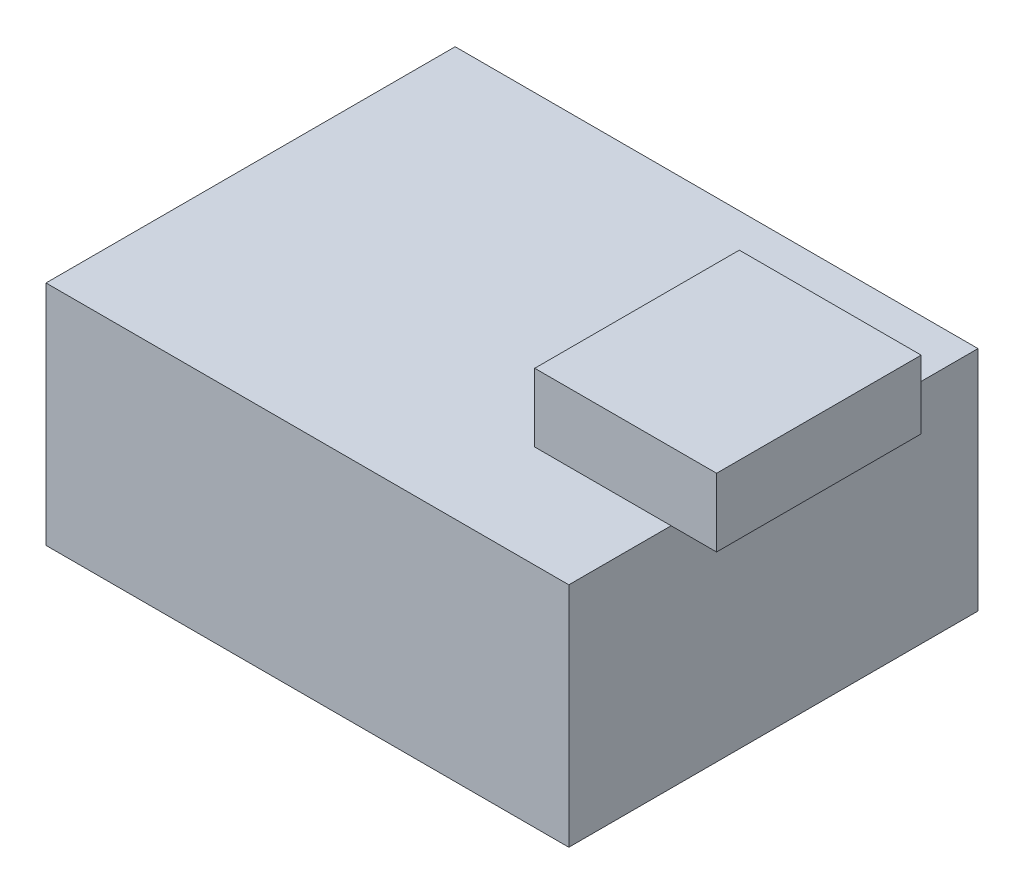
ISO-10303-21;
HEADER;
FILE_DESCRIPTION(('STEP AP214'),'2;1');
FILE_NAME('part.step','',(''),(''),'','','');
FILE_SCHEMA(('AUTOMOTIVE_DESIGN { 1 0 10303 214 1 1 1 1 }'));
ENDSEC;
DATA;
#1=APPLICATION_CONTEXT('core data for automotive mechanical design processes');
#2=APPLICATION_PROTOCOL_DEFINITION('international standard','automotive_design',2000,#1);
#3=PRODUCT_CONTEXT('',#1,'mechanical');
#4=PRODUCT('Part','Part','',(#3));
#5=PRODUCT_RELATED_PRODUCT_CATEGORY('part','',(#4));
#6=PRODUCT_DEFINITION_FORMATION('','',#4);
#7=PRODUCT_DEFINITION_CONTEXT('part definition',#1,'design');
#8=PRODUCT_DEFINITION('design','',#6,#7);
#9=PRODUCT_DEFINITION_SHAPE('','',#8);
#10=(LENGTH_UNIT() NAMED_UNIT(*) SI_UNIT(.MILLI.,.METRE.));
#11=(NAMED_UNIT(*) PLANE_ANGLE_UNIT() SI_UNIT($,.RADIAN.));
#12=(NAMED_UNIT(*) SI_UNIT($,.STERADIAN.) SOLID_ANGLE_UNIT());
#13=UNCERTAINTY_MEASURE_WITH_UNIT(LENGTH_MEASURE(1.E-05),#10,'distance_accuracy_value','');
#14=(GEOMETRIC_REPRESENTATION_CONTEXT(3) GLOBAL_UNCERTAINTY_ASSIGNED_CONTEXT((#13)) GLOBAL_UNIT_ASSIGNED_CONTEXT((#10,
#11,#12)) REPRESENTATION_CONTEXT('',''));
#15=CARTESIAN_POINT('',(0.,0.,0.));
#16=DIRECTION('',(0.,0.,1.));
#17=DIRECTION('',(1.,0.,0.));
#18=AXIS2_PLACEMENT_3D('',#15,#16,#17);
#19=CARTESIAN_POINT('',(0.,10.,0.));
#20=DIRECTION('',(0.,-1.,0.));
#21=DIRECTION('',(0.,0.,-1.));
#22=AXIS2_PLACEMENT_3D('',#19,#20,#21);
#23=PLANE('',#22);
#24=DIRECTION('',(-1.,0.,0.));
#25=VECTOR('',#24,1.);
#26=CARTESIAN_POINT('',(17.,10.,-13.5));
#27=LINE('',#26,#25);
#28=CARTESIAN_POINT('',(23.,10.,-13.5));
#29=VERTEX_POINT('',#28);
#30=CARTESIAN_POINT('',(17.,10.,-13.5));
#31=VERTEX_POINT('',#30);
#32=EDGE_CURVE('E11',#29,#31,#27,.T.);
#33=ORIENTED_EDGE('',*,*,#32,.F.);
#34=DIRECTION('',(0.,0.,-1.));
#35=VECTOR('',#34,1.);
#36=CARTESIAN_POINT('',(23.,10.,0.));
#37=LINE('',#36,#35);
#38=CARTESIAN_POINT('',(23.,10.,-18.));
#39=VERTEX_POINT('',#38);
#40=EDGE_CURVE('E157',#29,#39,#37,.T.);
#41=ORIENTED_EDGE('',*,*,#40,.T.);
#42=DIRECTION('',(-1.,0.,0.));
#43=VECTOR('',#42,1.);
#44=CARTESIAN_POINT('',(0.,10.,-18.));
#45=LINE('',#44,#43);
#46=CARTESIAN_POINT('',(0.,10.,-18.));
#47=VERTEX_POINT('',#46);
#48=EDGE_CURVE('E161',#39,#47,#45,.T.);
#49=ORIENTED_EDGE('',*,*,#48,.T.);
#50=DIRECTION('',(0.,0.,1.));
#51=VECTOR('',#50,1.);
#52=CARTESIAN_POINT('',(0.,10.,0.));
#53=LINE('',#52,#51);
#54=CARTESIAN_POINT('',(0.,10.,0.));
#55=VERTEX_POINT('',#54);
#56=EDGE_CURVE('E149',#47,#55,#53,.T.);
#57=ORIENTED_EDGE('',*,*,#56,.T.);
#58=DIRECTION('',(1.,0.,0.));
#59=VECTOR('',#58,1.);
#60=CARTESIAN_POINT('',(0.,10.,0.));
#61=LINE('',#60,#59);
#62=CARTESIAN_POINT('',(23.,10.,0.));
#63=VERTEX_POINT('',#62);
#64=EDGE_CURVE('E153',#55,#63,#61,.T.);
#65=ORIENTED_EDGE('',*,*,#64,.T.);
#66=CARTESIAN_POINT('',(23.,10.,-4.5));
#67=VERTEX_POINT('',#66);
#68=EDGE_CURVE('E158',#63,#67,#37,.T.);
#69=ORIENTED_EDGE('',*,*,#68,.T.);
#70=DIRECTION('',(1.,0.,0.));
#71=VECTOR('',#70,1.);
#72=CARTESIAN_POINT('',(17.,10.,-4.5));
#73=LINE('',#72,#71);
#74=CARTESIAN_POINT('',(17.,10.,-4.5));
#75=VERTEX_POINT('',#74);
#76=EDGE_CURVE('E65',#75,#67,#73,.T.);
#77=ORIENTED_EDGE('',*,*,#76,.F.);
#78=DIRECTION('',(0.,0.,1.));
#79=VECTOR('',#78,1.);
#80=CARTESIAN_POINT('',(17.,10.,-13.5));
#81=LINE('',#80,#79);
#82=EDGE_CURVE('E61',#31,#75,#81,.T.);
#83=ORIENTED_EDGE('',*,*,#82,.F.);
#84=EDGE_LOOP('',(#33,#41,#49,#57,#65,#69,#77,#83));
#85=FACE_BOUND('',#84,.T.);
#86=ADVANCED_FACE('F43',(#85),#23,.F.);
#87=CARTESIAN_POINT('',(0.,10.,0.));
#88=DIRECTION('',(1.,0.,0.));
#89=DIRECTION('',(0.,0.,-1.));
#90=AXIS2_PLACEMENT_3D('',#87,#88,#89);
#91=PLANE('',#90);
#92=DIRECTION('',(0.,0.,1.));
#93=VECTOR('',#92,1.);
#94=CARTESIAN_POINT('',(0.,0.,0.));
#95=LINE('',#94,#93);
#96=CARTESIAN_POINT('',(0.,0.,-18.));
#97=VERTEX_POINT('',#96);
#98=CARTESIAN_POINT('',(0.,0.,0.));
#99=VERTEX_POINT('',#98);
#100=EDGE_CURVE('E138',#97,#99,#95,.T.);
#101=ORIENTED_EDGE('',*,*,#100,.T.);
#102=DIRECTION('',(0.,-1.,0.));
#103=VECTOR('',#102,1.);
#104=CARTESIAN_POINT('',(0.,10.,0.));
#105=LINE('',#104,#103);
#106=EDGE_CURVE('E47',#55,#99,#105,.T.);
#107=ORIENTED_EDGE('',*,*,#106,.F.);
#108=ORIENTED_EDGE('',*,*,#56,.F.);
#109=DIRECTION('',(0.,-1.,0.));
#110=VECTOR('',#109,1.);
#111=CARTESIAN_POINT('',(0.,10.,-18.));
#112=LINE('',#111,#110);
#113=EDGE_CURVE('E164',#47,#97,#112,.T.);
#114=ORIENTED_EDGE('',*,*,#113,.T.);
#115=EDGE_LOOP('',(#101,#107,#108,#114));
#116=FACE_BOUND('',#115,.T.);
#117=ADVANCED_FACE('F45',(#116),#91,.F.);
#118=CARTESIAN_POINT('',(0.,10.,0.));
#119=DIRECTION('',(0.,0.,-1.));
#120=DIRECTION('',(-1.,0.,0.));
#121=AXIS2_PLACEMENT_3D('',#118,#119,#120);
#122=PLANE('',#121);
#123=DIRECTION('',(1.,0.,0.));
#124=VECTOR('',#123,1.);
#125=CARTESIAN_POINT('',(0.,0.,0.));
#126=LINE('',#125,#124);
#127=CARTESIAN_POINT('',(23.,0.,0.));
#128=VERTEX_POINT('',#127);
#129=EDGE_CURVE('E143',#99,#128,#126,.T.);
#130=ORIENTED_EDGE('',*,*,#129,.T.);
#131=DIRECTION('',(0.,-1.,0.));
#132=VECTOR('',#131,1.);
#133=CARTESIAN_POINT('',(23.,10.,0.));
#134=LINE('',#133,#132);
#135=EDGE_CURVE('E179',#63,#128,#134,.T.);
#136=ORIENTED_EDGE('',*,*,#135,.F.);
#137=ORIENTED_EDGE('',*,*,#64,.F.);
#138=ORIENTED_EDGE('',*,*,#106,.T.);
#139=EDGE_LOOP('',(#130,#136,#137,#138));
#140=FACE_BOUND('',#139,.T.);
#141=ADVANCED_FACE('F190',(#140),#122,.F.);
#142=CARTESIAN_POINT('',(23.,10.,0.));
#143=DIRECTION('',(-1.,0.,0.));
#144=DIRECTION('',(0.,0.,1.));
#145=AXIS2_PLACEMENT_3D('',#142,#143,#144);
#146=PLANE('',#145);
#147=DIRECTION('',(0.,0.,-1.));
#148=VECTOR('',#147,1.);
#149=CARTESIAN_POINT('',(23.,0.,0.));
#150=LINE('',#149,#148);
#151=CARTESIAN_POINT('',(23.,0.,-18.));
#152=VERTEX_POINT('',#151);
#153=EDGE_CURVE('E168',#128,#152,#150,.T.);
#154=ORIENTED_EDGE('',*,*,#153,.T.);
#155=DIRECTION('',(0.,-1.,0.));
#156=VECTOR('',#155,1.);
#157=CARTESIAN_POINT('',(23.,10.,-18.));
#158=LINE('',#157,#156);
#159=EDGE_CURVE('E176',#39,#152,#158,.T.);
#160=ORIENTED_EDGE('',*,*,#159,.F.);
#161=ORIENTED_EDGE('',*,*,#40,.F.);
#162=EDGE_CURVE('E162',#67,#29,#37,.T.);
#163=ORIENTED_EDGE('',*,*,#162,.F.);
#164=ORIENTED_EDGE('',*,*,#68,.F.);
#165=ORIENTED_EDGE('',*,*,#135,.T.);
#166=EDGE_LOOP('',(#154,#160,#161,#163,#164,#165));
#167=FACE_BOUND('',#166,.T.);
#168=ADVANCED_FACE('F199',(#167),#146,.F.);
#169=CARTESIAN_POINT('',(0.,10.,-18.));
#170=DIRECTION('',(0.,0.,1.));
#171=DIRECTION('',(1.,0.,0.));
#172=AXIS2_PLACEMENT_3D('',#169,#170,#171);
#173=PLANE('',#172);
#174=DIRECTION('',(-1.,0.,0.));
#175=VECTOR('',#174,1.);
#176=CARTESIAN_POINT('',(0.,0.,-18.));
#177=LINE('',#176,#175);
#178=EDGE_CURVE('E154',#152,#97,#177,.T.);
#179=ORIENTED_EDGE('',*,*,#178,.T.);
#180=ORIENTED_EDGE('',*,*,#113,.F.);
#181=ORIENTED_EDGE('',*,*,#48,.F.);
#182=ORIENTED_EDGE('',*,*,#159,.T.);
#183=EDGE_LOOP('',(#179,#180,#181,#182));
#184=FACE_BOUND('',#183,.T.);
#185=ADVANCED_FACE('F203',(#184),#173,.F.);
#186=CARTESIAN_POINT('',(0.,0.,0.));
#187=DIRECTION('',(0.,-1.,0.));
#188=DIRECTION('',(0.,0.,-1.));
#189=AXIS2_PLACEMENT_3D('',#186,#187,#188);
#190=PLANE('',#189);
#191=ORIENTED_EDGE('',*,*,#100,.F.);
#192=ORIENTED_EDGE('',*,*,#178,.F.);
#193=ORIENTED_EDGE('',*,*,#153,.F.);
#194=ORIENTED_EDGE('',*,*,#129,.F.);
#195=EDGE_LOOP('',(#191,#192,#193,#194));
#196=FACE_BOUND('',#195,.T.);
#197=ADVANCED_FACE('F197',(#196),#190,.T.);
#198=CARTESIAN_POINT('',(0.,10.,0.));
#199=DIRECTION('',(0.,1.,0.));
#200=DIRECTION('',(0.,0.,1.));
#201=AXIS2_PLACEMENT_3D('',#198,#199,#200);
#202=PLANE('',#201);
#203=CARTESIAN_POINT('',(25.,10.,-4.5));
#204=VERTEX_POINT('',#203);
#205=EDGE_CURVE('E214',#67,#204,#73,.T.);
#206=ORIENTED_EDGE('',*,*,#205,.F.);
#207=ORIENTED_EDGE('',*,*,#162,.T.);
#208=CARTESIAN_POINT('',(25.,10.,-13.5));
#209=VERTEX_POINT('',#208);
#210=EDGE_CURVE('E54',#209,#29,#27,.T.);
#211=ORIENTED_EDGE('',*,*,#210,.F.);
#212=DIRECTION('',(0.,0.,-1.));
#213=VECTOR('',#212,1.);
#214=CARTESIAN_POINT('',(25.,10.,-13.5));
#215=LINE('',#214,#213);
#216=EDGE_CURVE('E220',#204,#209,#215,.T.);
#217=ORIENTED_EDGE('',*,*,#216,.F.);
#218=EDGE_LOOP('',(#206,#207,#211,#217));
#219=FACE_BOUND('',#218,.T.);
#220=ADVANCED_FACE('F212',(#219),#202,.F.);
#221=CARTESIAN_POINT('',(17.,13.,-13.5));
#222=DIRECTION('',(1.,0.,0.));
#223=DIRECTION('',(0.,0.,-1.));
#224=AXIS2_PLACEMENT_3D('',#221,#222,#223);
#225=PLANE('',#224);
#226=ORIENTED_EDGE('',*,*,#82,.T.);
#227=DIRECTION('',(0.,-1.,0.));
#228=VECTOR('',#227,1.);
#229=CARTESIAN_POINT('',(17.,13.,-4.5));
#230=LINE('',#229,#228);
#231=CARTESIAN_POINT('',(17.,13.,-4.5));
#232=VERTEX_POINT('',#231);
#233=EDGE_CURVE('E118',#232,#75,#230,.T.);
#234=ORIENTED_EDGE('',*,*,#233,.F.);
#235=DIRECTION('',(0.,0.,1.));
#236=VECTOR('',#235,1.);
#237=CARTESIAN_POINT('',(17.,13.,-13.5));
#238=LINE('',#237,#236);
#239=CARTESIAN_POINT('',(17.,13.,-13.5));
#240=VERTEX_POINT('',#239);
#241=EDGE_CURVE('E125',#240,#232,#238,.T.);
#242=ORIENTED_EDGE('',*,*,#241,.F.);
#243=DIRECTION('',(0.,-1.,0.));
#244=VECTOR('',#243,1.);
#245=CARTESIAN_POINT('',(17.,13.,-13.5));
#246=LINE('',#245,#244);
#247=EDGE_CURVE('E225',#240,#31,#246,.T.);
#248=ORIENTED_EDGE('',*,*,#247,.T.);
#249=EDGE_LOOP('',(#226,#234,#242,#248));
#250=FACE_BOUND('',#249,.T.);
#251=ADVANCED_FACE('F136',(#250),#225,.F.);
#252=CARTESIAN_POINT('',(17.,13.,-4.5));
#253=DIRECTION('',(0.,0.,-1.));
#254=DIRECTION('',(-1.,0.,0.));
#255=AXIS2_PLACEMENT_3D('',#252,#253,#254);
#256=PLANE('',#255);
#257=ORIENTED_EDGE('',*,*,#76,.T.);
#258=ORIENTED_EDGE('',*,*,#205,.T.);
#259=DIRECTION('',(0.,-1.,0.));
#260=VECTOR('',#259,1.);
#261=CARTESIAN_POINT('',(25.,13.,-4.5));
#262=LINE('',#261,#260);
#263=CARTESIAN_POINT('',(25.,13.,-4.5));
#264=VERTEX_POINT('',#263);
#265=EDGE_CURVE('E120',#264,#204,#262,.T.);
#266=ORIENTED_EDGE('',*,*,#265,.F.);
#267=DIRECTION('',(1.,0.,0.));
#268=VECTOR('',#267,1.);
#269=CARTESIAN_POINT('',(17.,13.,-4.5));
#270=LINE('',#269,#268);
#271=EDGE_CURVE('E114',#232,#264,#270,.T.);
#272=ORIENTED_EDGE('',*,*,#271,.F.);
#273=ORIENTED_EDGE('',*,*,#233,.T.);
#274=EDGE_LOOP('',(#257,#258,#266,#272,#273));
#275=FACE_BOUND('',#274,.T.);
#276=ADVANCED_FACE('F116',(#275),#256,.F.);
#277=CARTESIAN_POINT('',(25.,13.,-13.5));
#278=DIRECTION('',(-1.,0.,0.));
#279=DIRECTION('',(0.,0.,1.));
#280=AXIS2_PLACEMENT_3D('',#277,#278,#279);
#281=PLANE('',#280);
#282=ORIENTED_EDGE('',*,*,#216,.T.);
#283=DIRECTION('',(0.,-1.,0.));
#284=VECTOR('',#283,1.);
#285=CARTESIAN_POINT('',(25.,13.,-13.5));
#286=LINE('',#285,#284);
#287=CARTESIAN_POINT('',(25.,13.,-13.5));
#288=VERTEX_POINT('',#287);
#289=EDGE_CURVE('E145',#288,#209,#286,.T.);
#290=ORIENTED_EDGE('',*,*,#289,.F.);
#291=DIRECTION('',(0.,0.,-1.));
#292=VECTOR('',#291,1.);
#293=CARTESIAN_POINT('',(25.,13.,-13.5));
#294=LINE('',#293,#292);
#295=EDGE_CURVE('E124',#264,#288,#294,.T.);
#296=ORIENTED_EDGE('',*,*,#295,.F.);
#297=ORIENTED_EDGE('',*,*,#265,.T.);
#298=EDGE_LOOP('',(#282,#290,#296,#297));
#299=FACE_BOUND('',#298,.T.);
#300=ADVANCED_FACE('F237',(#299),#281,.F.);
#301=CARTESIAN_POINT('',(17.,13.,-13.5));
#302=DIRECTION('',(0.,0.,1.));
#303=DIRECTION('',(1.,0.,0.));
#304=AXIS2_PLACEMENT_3D('',#301,#302,#303);
#305=PLANE('',#304);
#306=ORIENTED_EDGE('',*,*,#210,.T.);
#307=ORIENTED_EDGE('',*,*,#32,.T.);
#308=ORIENTED_EDGE('',*,*,#247,.F.);
#309=DIRECTION('',(-1.,0.,0.));
#310=VECTOR('',#309,1.);
#311=CARTESIAN_POINT('',(17.,13.,-13.5));
#312=LINE('',#311,#310);
#313=EDGE_CURVE('E130',#288,#240,#312,.T.);
#314=ORIENTED_EDGE('',*,*,#313,.F.);
#315=ORIENTED_EDGE('',*,*,#289,.T.);
#316=EDGE_LOOP('',(#306,#307,#308,#314,#315));
#317=FACE_BOUND('',#316,.T.);
#318=ADVANCED_FACE('F217',(#317),#305,.F.);
#319=CARTESIAN_POINT('',(0.,13.,0.));
#320=DIRECTION('',(0.,1.,0.));
#321=DIRECTION('',(0.,0.,1.));
#322=AXIS2_PLACEMENT_3D('',#319,#320,#321);
#323=PLANE('',#322);
#324=ORIENTED_EDGE('',*,*,#241,.T.);
#325=ORIENTED_EDGE('',*,*,#271,.T.);
#326=ORIENTED_EDGE('',*,*,#295,.T.);
#327=ORIENTED_EDGE('',*,*,#313,.T.);
#328=EDGE_LOOP('',(#324,#325,#326,#327));
#329=FACE_BOUND('',#328,.T.);
#330=ADVANCED_FACE('F128',(#329),#323,.T.);
#331=CLOSED_SHELL('',(#86,#117,#141,#168,#185,#197,#220,#251,#276,#300,#318,#330));
#332=MANIFOLD_SOLID_BREP('B2',#331);
#333=ADVANCED_BREP_SHAPE_REPRESENTATION('',(#18,#332),#14);
#334=SHAPE_DEFINITION_REPRESENTATION(#9,#333);
ENDSEC;
END-ISO-10303-21;
